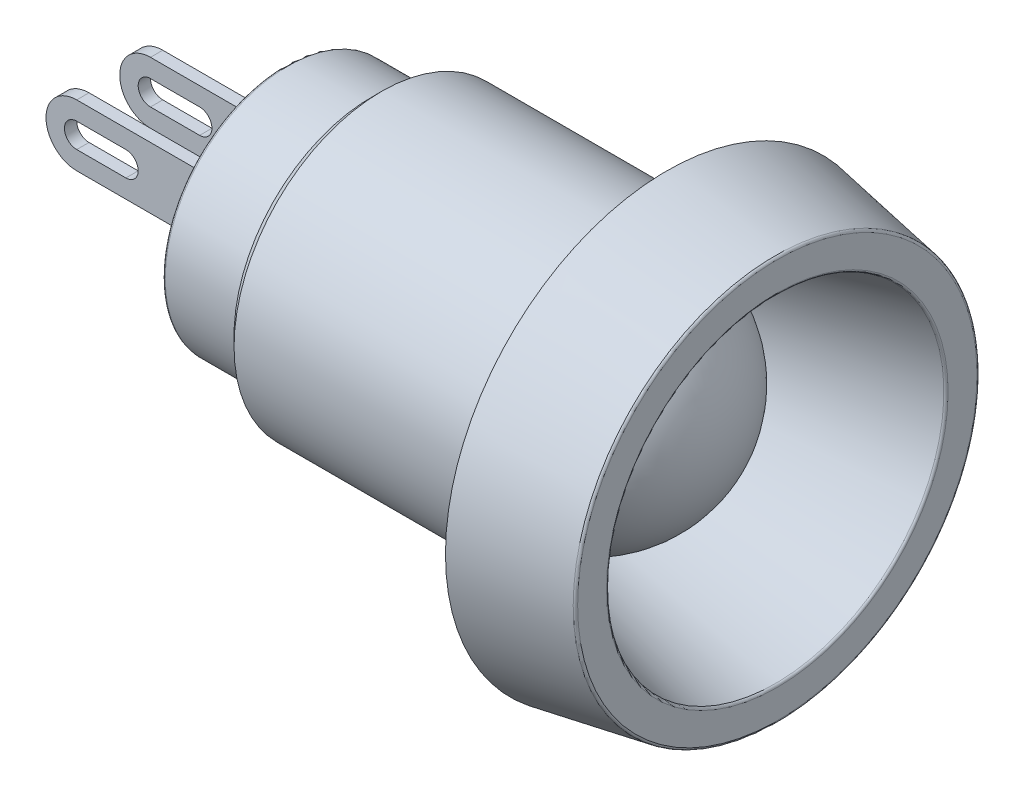
ISO-10303-21;
HEADER;
FILE_DESCRIPTION(('STEP AP214'),'2;1');
FILE_NAME('part.step','',(''),(''),'','','');
FILE_SCHEMA(('AUTOMOTIVE_DESIGN { 1 0 10303 214 1 1 1 1 }'));
ENDSEC;
DATA;
#1=APPLICATION_CONTEXT('core data for automotive mechanical design processes');
#2=APPLICATION_PROTOCOL_DEFINITION('international standard','automotive_design',2000,#1);
#3=PRODUCT_CONTEXT('',#1,'mechanical');
#4=PRODUCT('Part','Part','',(#3));
#5=PRODUCT_RELATED_PRODUCT_CATEGORY('part','',(#4));
#6=PRODUCT_DEFINITION_FORMATION('','',#4);
#7=PRODUCT_DEFINITION_CONTEXT('part definition',#1,'design');
#8=PRODUCT_DEFINITION('design','',#6,#7);
#9=PRODUCT_DEFINITION_SHAPE('','',#8);
#10=(LENGTH_UNIT() NAMED_UNIT(*) SI_UNIT(.MILLI.,.METRE.));
#11=(NAMED_UNIT(*) PLANE_ANGLE_UNIT() SI_UNIT($,.RADIAN.));
#12=(NAMED_UNIT(*) SI_UNIT($,.STERADIAN.) SOLID_ANGLE_UNIT());
#13=UNCERTAINTY_MEASURE_WITH_UNIT(LENGTH_MEASURE(1.E-05),#10,'distance_accuracy_value','');
#14=(GEOMETRIC_REPRESENTATION_CONTEXT(3) GLOBAL_UNCERTAINTY_ASSIGNED_CONTEXT((#13)) GLOBAL_UNIT_ASSIGNED_CONTEXT((#10,
#11,#12)) REPRESENTATION_CONTEXT('',''));
#15=CARTESIAN_POINT('',(0.,0.,0.));
#16=DIRECTION('',(0.,0.,1.));
#17=DIRECTION('',(1.,0.,0.));
#18=AXIS2_PLACEMENT_3D('',#15,#16,#17);
#19=CARTESIAN_POINT('',(9.,0.,0.));
#20=DIRECTION('',(1.,0.,0.));
#21=DIRECTION('',(0.,0.,-1.));
#22=AXIS2_PLACEMENT_3D('',#19,#20,#21);
#23=PLANE('',#22);
#24=DIRECTION('',(0.,1.,0.));
#25=VECTOR('',#24,1.);
#26=CARTESIAN_POINT('',(9.,-1.25,-1.25));
#27=LINE('',#26,#25);
#28=CARTESIAN_POINT('',(9.,-1.25,-1.25));
#29=VERTEX_POINT('',#28);
#30=CARTESIAN_POINT('',(9.,1.25,-1.25));
#31=VERTEX_POINT('',#30);
#32=EDGE_CURVE('E232',#29,#31,#27,.T.);
#33=ORIENTED_EDGE('',*,*,#32,.F.);
#34=DIRECTION('',(0.,0.,-1.));
#35=VECTOR('',#34,1.);
#36=CARTESIAN_POINT('',(9.,-1.25,-1.25));
#37=LINE('',#36,#35);
#38=CARTESIAN_POINT('',(9.,-1.25,-1.75));
#39=VERTEX_POINT('',#38);
#40=EDGE_CURVE('E248',#29,#39,#37,.T.);
#41=ORIENTED_EDGE('',*,*,#40,.T.);
#42=DIRECTION('',(0.,1.,0.));
#43=VECTOR('',#42,1.);
#44=CARTESIAN_POINT('',(9.,-1.25,-1.75));
#45=LINE('',#44,#43);
#46=CARTESIAN_POINT('',(9.,1.25,-1.75));
#47=VERTEX_POINT('',#46);
#48=EDGE_CURVE('E245',#39,#47,#45,.T.);
#49=ORIENTED_EDGE('',*,*,#48,.T.);
#50=DIRECTION('',(0.,0.,-1.));
#51=VECTOR('',#50,1.);
#52=CARTESIAN_POINT('',(9.,1.25,-1.25));
#53=LINE('',#52,#51);
#54=EDGE_CURVE('E242',#31,#47,#53,.T.);
#55=ORIENTED_EDGE('',*,*,#54,.F.);
#56=EDGE_LOOP('',(#33,#41,#49,#55));
#57=FACE_BOUND('',#56,.T.);
#58=DIRECTION('',(0.,0.,1.));
#59=VECTOR('',#58,1.);
#60=CARTESIAN_POINT('',(9.,-1.25,0.));
#61=LINE('',#60,#59);
#62=CARTESIAN_POINT('',(9.,-1.25,1.25));
#63=VERTEX_POINT('',#62);
#64=CARTESIAN_POINT('',(9.,-1.25,1.75));
#65=VERTEX_POINT('',#64);
#66=EDGE_CURVE('E254',#63,#65,#61,.T.);
#67=ORIENTED_EDGE('',*,*,#66,.F.);
#68=DIRECTION('',(0.,1.,0.));
#69=VECTOR('',#68,1.);
#70=CARTESIAN_POINT('',(9.,0.,1.25));
#71=LINE('',#70,#69);
#72=CARTESIAN_POINT('',(9.,1.25,1.25));
#73=VERTEX_POINT('',#72);
#74=EDGE_CURVE('E251',#63,#73,#71,.T.);
#75=ORIENTED_EDGE('',*,*,#74,.T.);
#76=DIRECTION('',(0.,0.,1.));
#77=VECTOR('',#76,1.);
#78=CARTESIAN_POINT('',(9.,1.25,0.));
#79=LINE('',#78,#77);
#80=CARTESIAN_POINT('',(9.,1.25,1.75));
#81=VERTEX_POINT('',#80);
#82=EDGE_CURVE('E260',#73,#81,#79,.T.);
#83=ORIENTED_EDGE('',*,*,#82,.T.);
#84=DIRECTION('',(0.,1.,0.));
#85=VECTOR('',#84,1.);
#86=CARTESIAN_POINT('',(9.,0.,1.75));
#87=LINE('',#86,#85);
#88=EDGE_CURVE('E257',#65,#81,#87,.T.);
#89=ORIENTED_EDGE('',*,*,#88,.F.);
#90=EDGE_LOOP('',(#67,#75,#83,#89));
#91=FACE_BOUND('',#90,.T.);
#92=CARTESIAN_POINT('',(9.,0.,0.));
#93=DIRECTION('',(1.,0.,0.));
#94=DIRECTION('',(0.,0.,-1.));
#95=AXIS2_PLACEMENT_3D('',#92,#93,#94);
#96=CIRCLE('',#95,4.9);
#97=CARTESIAN_POINT('',(9.,0.,-4.9));
#98=VERTEX_POINT('',#97);
#99=EDGE_CURVE('E289',#98,#98,#96,.F.);
#100=ORIENTED_EDGE('',*,*,#99,.T.);
#101=EDGE_LOOP('',(#100));
#102=FACE_BOUND('',#101,.T.);
#103=ADVANCED_FACE('F39',(#57,#91,#102),#23,.F.);
#104=CARTESIAN_POINT('',(9.,0.,0.));
#105=DIRECTION('',(-1.,0.,0.));
#106=DIRECTION('',(0.,0.,1.));
#107=AXIS2_PLACEMENT_3D('',#104,#105,#106);
#108=CYLINDRICAL_SURFACE('',#107,5.);
#109=CARTESIAN_POINT('',(9.1,0.,0.));
#110=DIRECTION('',(1.,0.,0.));
#111=DIRECTION('',(0.,0.,-1.));
#112=AXIS2_PLACEMENT_3D('',#109,#110,#111);
#113=CIRCLE('',#112,5.);
#114=CARTESIAN_POINT('',(9.1,0.,-5.));
#115=VERTEX_POINT('',#114);
#116=EDGE_CURVE('E292',#115,#115,#113,.T.);
#117=ORIENTED_EDGE('',*,*,#116,.T.);
#118=EDGE_LOOP('',(#117));
#119=FACE_BOUND('',#118,.T.);
#120=CARTESIAN_POINT('',(12.5,0.,0.));
#121=DIRECTION('',(-1.,0.,0.));
#122=DIRECTION('',(0.,0.,1.));
#123=AXIS2_PLACEMENT_3D('',#120,#121,#122);
#124=CIRCLE('',#123,5.);
#125=CARTESIAN_POINT('',(12.5,0.,5.));
#126=VERTEX_POINT('',#125);
#127=EDGE_CURVE('E280',#126,#126,#124,.T.);
#128=ORIENTED_EDGE('',*,*,#127,.T.);
#129=EDGE_LOOP('',(#128));
#130=FACE_BOUND('',#129,.T.);
#131=ADVANCED_FACE('F371',(#119,#130),#108,.T.);
#132=CARTESIAN_POINT('',(12.5,5.,0.));
#133=DIRECTION('',(1.,0.,0.));
#134=DIRECTION('',(0.,0.,-1.));
#135=AXIS2_PLACEMENT_3D('',#132,#133,#134);
#136=PLANE('',#135);
#137=CARTESIAN_POINT('',(12.5,0.,0.));
#138=DIRECTION('',(1.,0.,0.));
#139=DIRECTION('',(0.,0.,-1.));
#140=AXIS2_PLACEMENT_3D('',#137,#138,#139);
#141=CIRCLE('',#140,5.60000000000001);
#142=CARTESIAN_POINT('',(12.5,0.,-5.60000000000001));
#143=VERTEX_POINT('',#142);
#144=EDGE_CURVE('E283',#143,#143,#141,.F.);
#145=ORIENTED_EDGE('',*,*,#144,.T.);
#146=EDGE_LOOP('',(#145));
#147=FACE_BOUND('',#146,.T.);
#148=ORIENTED_EDGE('',*,*,#127,.F.);
#149=EDGE_LOOP('',(#148));
#150=FACE_BOUND('',#149,.T.);
#151=ADVANCED_FACE('F376',(#147,#150),#136,.F.);
#152=CARTESIAN_POINT('',(9.,0.,0.));
#153=DIRECTION('',(-1.,0.,0.));
#154=DIRECTION('',(0.,0.,1.));
#155=AXIS2_PLACEMENT_3D('',#152,#153,#154);
#156=CYLINDRICAL_SURFACE('',#155,6.);
#157=CARTESIAN_POINT('',(12.9,0.,0.));
#158=DIRECTION('',(1.,0.,0.));
#159=DIRECTION('',(0.,0.,-1.));
#160=AXIS2_PLACEMENT_3D('',#157,#158,#159);
#161=CIRCLE('',#160,6.);
#162=CARTESIAN_POINT('',(12.9,0.,-6.));
#163=VERTEX_POINT('',#162);
#164=EDGE_CURVE('E286',#163,#163,#161,.T.);
#165=ORIENTED_EDGE('',*,*,#164,.T.);
#166=EDGE_LOOP('',(#165));
#167=FACE_BOUND('',#166,.T.);
#168=CARTESIAN_POINT('',(24.5,0.,0.));
#169=DIRECTION('',(-1.,0.,0.));
#170=DIRECTION('',(0.,0.,1.));
#171=AXIS2_PLACEMENT_3D('',#168,#169,#170);
#172=CIRCLE('',#171,6.);
#173=CARTESIAN_POINT('',(24.5,0.,6.));
#174=VERTEX_POINT('',#173);
#175=EDGE_CURVE('E277',#174,#174,#172,.T.);
#176=ORIENTED_EDGE('',*,*,#175,.T.);
#177=EDGE_LOOP('',(#176));
#178=FACE_BOUND('',#177,.T.);
#179=ADVANCED_FACE('F666',(#167,#178),#156,.T.);
#180=CARTESIAN_POINT('',(24.5,6.,0.));
#181=DIRECTION('',(1.,0.,0.));
#182=DIRECTION('',(0.,0.,-1.));
#183=AXIS2_PLACEMENT_3D('',#180,#181,#182);
#184=PLANE('',#183);
#185=ORIENTED_EDGE('',*,*,#175,.F.);
#186=EDGE_LOOP('',(#185));
#187=FACE_BOUND('',#186,.T.);
#188=CARTESIAN_POINT('',(24.5,0.,0.));
#189=DIRECTION('',(-1.,0.,0.));
#190=DIRECTION('',(0.,0.,1.));
#191=AXIS2_PLACEMENT_3D('',#188,#189,#190);
#192=CIRCLE('',#191,9.);
#193=CARTESIAN_POINT('',(24.5,0.,9.));
#194=VERTEX_POINT('',#193);
#195=EDGE_CURVE('E274',#194,#194,#192,.T.);
#196=ORIENTED_EDGE('',*,*,#195,.T.);
#197=EDGE_LOOP('',(#196));
#198=FACE_BOUND('',#197,.T.);
#199=ADVANCED_FACE('F658',(#187,#198),#184,.F.);
#200=CARTESIAN_POINT('',(29.,0.,0.));
#201=DIRECTION('',(-1.,0.,0.));
#202=DIRECTION('',(0.,0.,1.));
#203=AXIS2_PLACEMENT_3D('',#200,#201,#202);
#204=CONICAL_SURFACE('',#203,8.20652858681191,0.174532925199433);
#205=CARTESIAN_POINT('',(28.9173648177667,0.,0.));
#206=DIRECTION('',(1.,0.,0.));
#207=DIRECTION('',(0.,0.,-1.));
#208=AXIS2_PLACEMENT_3D('',#205,#206,#207);
#209=CIRCLE('',#208,8.2210993989954);
#210=CARTESIAN_POINT('',(28.9173648177667,0.,-8.2210993989954));
#211=VERTEX_POINT('',#210);
#212=EDGE_CURVE('E304',#211,#211,#209,.F.);
#213=ORIENTED_EDGE('',*,*,#212,.T.);
#214=EDGE_LOOP('',(#213));
#215=FACE_BOUND('',#214,.T.);
#216=ORIENTED_EDGE('',*,*,#195,.F.);
#217=EDGE_LOOP('',(#216));
#218=FACE_BOUND('',#217,.T.);
#219=ADVANCED_FACE('F649',(#215,#218),#204,.T.);
#220=CARTESIAN_POINT('',(29.,8.20652858681191,0.));
#221=DIRECTION('',(-1.,0.,0.));
#222=DIRECTION('',(0.,0.,1.));
#223=AXIS2_PLACEMENT_3D('',#220,#221,#222);
#224=PLANE('',#223);
#225=CARTESIAN_POINT('',(29.,0.,0.));
#226=DIRECTION('',(-1.,0.,0.));
#227=DIRECTION('',(0.,0.,1.));
#228=AXIS2_PLACEMENT_3D('',#225,#226,#227);
#229=CIRCLE('',#228,6.94808858397454);
#230=CARTESIAN_POINT('',(29.,0.,6.94808858397454));
#231=VERTEX_POINT('',#230);
#232=EDGE_CURVE('E298',#231,#231,#229,.T.);
#233=ORIENTED_EDGE('',*,*,#232,.T.);
#234=EDGE_LOOP('',(#233));
#235=FACE_BOUND('',#234,.T.);
#236=CARTESIAN_POINT('',(29.,0.,0.));
#237=DIRECTION('',(-1.,0.,0.));
#238=DIRECTION('',(0.,0.,1.));
#239=AXIS2_PLACEMENT_3D('',#236,#237,#238);
#240=CIRCLE('',#239,8.12261862369418);
#241=CARTESIAN_POINT('',(29.,0.,8.12261862369418));
#242=VERTEX_POINT('',#241);
#243=EDGE_CURVE('E295',#242,#242,#240,.F.);
#244=ORIENTED_EDGE('',*,*,#243,.T.);
#245=EDGE_LOOP('',(#244));
#246=FACE_BOUND('',#245,.T.);
#247=ADVANCED_FACE('F640',(#235,#246),#224,.F.);
#248=CARTESIAN_POINT('',(21.5,0.,0.));
#249=DIRECTION('',(1.,0.,0.));
#250=DIRECTION('',(0.,0.,-1.));
#251=AXIS2_PLACEMENT_3D('',#248,#249,#250);
#252=CONICAL_SURFACE('',#251,5.,0.244346095279207);
#253=CARTESIAN_POINT('',(28.92419218956,0.,0.));
#254=DIRECTION('',(-1.,0.,0.));
#255=DIRECTION('',(0.,0.,1.));
#256=AXIS2_PLACEMENT_3D('',#253,#254,#255);
#257=CIRCLE('',#256,6.85105901134694);
#258=CARTESIAN_POINT('',(28.92419218956,0.,6.85105901134694));
#259=VERTEX_POINT('',#258);
#260=EDGE_CURVE('E301',#259,#259,#257,.F.);
#261=ORIENTED_EDGE('',*,*,#260,.T.);
#262=EDGE_LOOP('',(#261));
#263=FACE_BOUND('',#262,.T.);
#264=CARTESIAN_POINT('',(21.5,0.,0.));
#265=DIRECTION('',(-1.,0.,0.));
#266=DIRECTION('',(0.,0.,1.));
#267=AXIS2_PLACEMENT_3D('',#264,#265,#266);
#268=CIRCLE('',#267,5.);
#269=CARTESIAN_POINT('',(21.5,0.,5.));
#270=VERTEX_POINT('',#269);
#271=EDGE_CURVE('E271',#270,#270,#268,.T.);
#272=ORIENTED_EDGE('',*,*,#271,.T.);
#273=EDGE_LOOP('',(#272));
#274=FACE_BOUND('',#273,.T.);
#275=ADVANCED_FACE('F630',(#263,#274),#252,.F.);
#276=CARTESIAN_POINT('',(21.5,0.,0.));
#277=DIRECTION('',(-1.,0.,0.));
#278=DIRECTION('',(0.,1.,0.));
#279=AXIS2_PLACEMENT_3D('',#276,#277,#278);
#280=SPHERICAL_SURFACE('',#279,5.);
#281=ORIENTED_EDGE('',*,*,#271,.F.);
#282=EDGE_LOOP('',(#281));
#283=FACE_BOUND('',#282,.T.);
#284=ADVANCED_FACE('F385',(#283),#280,.T.);
#285=CARTESIAN_POINT('',(12.5,0.,0.));
#286=DIRECTION('',(1.,0.,0.));
#287=DIRECTION('',(0.,0.,-1.));
#288=AXIS2_PLACEMENT_3D('',#285,#286,#287);
#289=CONICAL_SURFACE('',#288,5.60000000000001,0.785398163397446);
#290=ORIENTED_EDGE('',*,*,#164,.F.);
#291=EDGE_LOOP('',(#290));
#292=FACE_BOUND('',#291,.T.);
#293=ORIENTED_EDGE('',*,*,#144,.F.);
#294=EDGE_LOOP('',(#293));
#295=FACE_BOUND('',#294,.T.);
#296=ADVANCED_FACE('F381',(#292,#295),#289,.T.);
#297=CARTESIAN_POINT('',(9.1,0.,0.));
#298=DIRECTION('',(1.,0.,0.));
#299=DIRECTION('',(0.,0.,-1.));
#300=AXIS2_PLACEMENT_3D('',#297,#298,#299);
#301=TOROIDAL_SURFACE('',#300,4.9,0.1);
#302=ORIENTED_EDGE('',*,*,#116,.F.);
#303=EDGE_LOOP('',(#302));
#304=FACE_BOUND('',#303,.T.);
#305=ORIENTED_EDGE('',*,*,#99,.F.);
#306=EDGE_LOOP('',(#305));
#307=FACE_BOUND('',#306,.T.);
#308=ADVANCED_FACE('F384',(#304,#307),#301,.T.);
#309=CARTESIAN_POINT('',(28.9,0.,0.));
#310=DIRECTION('',(-1.,0.,0.));
#311=DIRECTION('',(0.,0.,1.));
#312=AXIS2_PLACEMENT_3D('',#309,#310,#311);
#313=TOROIDAL_SURFACE('',#312,6.94808858397454,0.1);
#314=ORIENTED_EDGE('',*,*,#260,.F.);
#315=EDGE_LOOP('',(#314));
#316=FACE_BOUND('',#315,.T.);
#317=ORIENTED_EDGE('',*,*,#232,.F.);
#318=EDGE_LOOP('',(#317));
#319=FACE_BOUND('',#318,.T.);
#320=ADVANCED_FACE('F389',(#316,#319),#313,.T.);
#321=CARTESIAN_POINT('',(28.9,0.,0.));
#322=DIRECTION('',(-1.,0.,0.));
#323=DIRECTION('',(0.,0.,1.));
#324=AXIS2_PLACEMENT_3D('',#321,#322,#323);
#325=TOROIDAL_SURFACE('',#324,8.12261862369418,0.1);
#326=ORIENTED_EDGE('',*,*,#243,.F.);
#327=EDGE_LOOP('',(#326));
#328=FACE_BOUND('',#327,.T.);
#329=ORIENTED_EDGE('',*,*,#212,.F.);
#330=EDGE_LOOP('',(#329));
#331=FACE_BOUND('',#330,.T.);
#332=ADVANCED_FACE('F393',(#328,#331),#325,.T.);
#333=CARTESIAN_POINT('',(1.,0.,1.25));
#334=DIRECTION('',(0.,0.,-1.));
#335=DIRECTION('',(-1.,0.,0.));
#336=AXIS2_PLACEMENT_3D('',#333,#334,#335);
#337=PLANE('',#336);
#338=CARTESIAN_POINT('',(4.25,0.,1.25));
#339=DIRECTION('',(0.,0.,-1.));
#340=DIRECTION('',(-1.,0.,0.));
#341=AXIS2_PLACEMENT_3D('',#338,#339,#340);
#342=CIRCLE('',#341,0.5);
#343=CARTESIAN_POINT('',(4.25,0.5,1.25));
#344=VERTEX_POINT('',#343);
#345=CARTESIAN_POINT('',(4.25,-0.5,1.25));
#346=VERTEX_POINT('',#345);
#347=EDGE_CURVE('E228',#344,#346,#342,.T.);
#348=ORIENTED_EDGE('',*,*,#347,.F.);
#349=DIRECTION('',(1.,0.,0.));
#350=VECTOR('',#349,1.);
#351=CARTESIAN_POINT('',(1.,0.5,1.25));
#352=LINE('',#351,#350);
#353=CARTESIAN_POINT('',(2.25,0.5,1.25));
#354=VERTEX_POINT('',#353);
#355=EDGE_CURVE('E220',#354,#344,#352,.T.);
#356=ORIENTED_EDGE('',*,*,#355,.F.);
#357=CARTESIAN_POINT('',(2.25,0.,1.25));
#358=DIRECTION('',(0.,0.,-1.));
#359=DIRECTION('',(-1.,0.,0.));
#360=AXIS2_PLACEMENT_3D('',#357,#358,#359);
#361=CIRCLE('',#360,0.5);
#362=CARTESIAN_POINT('',(2.25,-0.499999999999999,1.25));
#363=VERTEX_POINT('',#362);
#364=EDGE_CURVE('E212',#363,#354,#361,.T.);
#365=ORIENTED_EDGE('',*,*,#364,.F.);
#366=DIRECTION('',(-1.,0.,0.));
#367=VECTOR('',#366,1.);
#368=CARTESIAN_POINT('',(1.,-0.5,1.25));
#369=LINE('',#368,#367);
#370=EDGE_CURVE('E206',#346,#363,#369,.T.);
#371=ORIENTED_EDGE('',*,*,#370,.F.);
#372=EDGE_LOOP('',(#348,#356,#365,#371));
#373=FACE_BOUND('',#372,.T.);
#374=DIRECTION('',(1.,0.,0.));
#375=VECTOR('',#374,1.);
#376=CARTESIAN_POINT('',(1.,-1.25,1.25));
#377=LINE('',#376,#375);
#378=CARTESIAN_POINT('',(2.25,-1.25,1.25));
#379=VERTEX_POINT('',#378);
#380=EDGE_CURVE('E269',#379,#63,#377,.T.);
#381=ORIENTED_EDGE('',*,*,#380,.F.);
#382=CARTESIAN_POINT('',(2.25,0.,1.25));
#383=DIRECTION('',(0.,0.,-1.));
#384=DIRECTION('',(-1.,0.,0.));
#385=AXIS2_PLACEMENT_3D('',#382,#383,#384);
#386=CIRCLE('',#385,1.25);
#387=CARTESIAN_POINT('',(1.,0.,1.25));
#388=VERTEX_POINT('',#387);
#389=EDGE_CURVE('E316',#379,#388,#386,.T.);
#390=ORIENTED_EDGE('',*,*,#389,.T.);
#391=CARTESIAN_POINT('',(2.25,0.,1.25));
#392=DIRECTION('',(0.,0.,-1.));
#393=DIRECTION('',(-1.,0.,0.));
#394=AXIS2_PLACEMENT_3D('',#391,#392,#393);
#395=CIRCLE('',#394,1.25);
#396=CARTESIAN_POINT('',(2.25,1.25,1.25));
#397=VERTEX_POINT('',#396);
#398=EDGE_CURVE('E314',#388,#397,#395,.T.);
#399=ORIENTED_EDGE('',*,*,#398,.T.);
#400=DIRECTION('',(1.,0.,0.));
#401=VECTOR('',#400,1.);
#402=CARTESIAN_POINT('',(1.,1.25,1.25));
#403=LINE('',#402,#401);
#404=EDGE_CURVE('E263',#397,#73,#403,.T.);
#405=ORIENTED_EDGE('',*,*,#404,.T.);
#406=ORIENTED_EDGE('',*,*,#74,.F.);
#407=EDGE_LOOP('',(#381,#390,#399,#405,#406));
#408=FACE_BOUND('',#407,.T.);
#409=ADVANCED_FACE('F397',(#373,#408),#337,.T.);
#410=CARTESIAN_POINT('',(1.,-1.25,0.));
#411=DIRECTION('',(0.,1.,0.));
#412=DIRECTION('',(0.,0.,1.));
#413=AXIS2_PLACEMENT_3D('',#410,#411,#412);
#414=PLANE('',#413);
#415=DIRECTION('',(1.,0.,0.));
#416=VECTOR('',#415,1.);
#417=CARTESIAN_POINT('',(1.,-1.25,1.75));
#418=LINE('',#417,#416);
#419=CARTESIAN_POINT('',(2.25,-1.25,1.75));
#420=VERTEX_POINT('',#419);
#421=EDGE_CURVE('E267',#420,#65,#418,.T.);
#422=ORIENTED_EDGE('',*,*,#421,.F.);
#423=DIRECTION('',(0.,0.,1.));
#424=VECTOR('',#423,1.);
#425=CARTESIAN_POINT('',(2.25,-1.25,1.25));
#426=LINE('',#425,#424);
#427=EDGE_CURVE('E311',#420,#379,#426,.F.);
#428=ORIENTED_EDGE('',*,*,#427,.T.);
#429=ORIENTED_EDGE('',*,*,#380,.T.);
#430=ORIENTED_EDGE('',*,*,#66,.T.);
#431=EDGE_LOOP('',(#422,#428,#429,#430));
#432=FACE_BOUND('',#431,.T.);
#433=ADVANCED_FACE('F441',(#432),#414,.F.);
#434=CARTESIAN_POINT('',(1.,0.,1.75));
#435=DIRECTION('',(0.,0.,-1.));
#436=DIRECTION('',(-1.,0.,0.));
#437=AXIS2_PLACEMENT_3D('',#434,#435,#436);
#438=PLANE('',#437);
#439=DIRECTION('',(1.,0.,0.));
#440=VECTOR('',#439,1.);
#441=CARTESIAN_POINT('',(1.,0.500000000000001,1.75));
#442=LINE('',#441,#440);
#443=CARTESIAN_POINT('',(2.25,0.500000000000001,1.75));
#444=VERTEX_POINT('',#443);
#445=CARTESIAN_POINT('',(4.25,0.500000000000001,1.75));
#446=VERTEX_POINT('',#445);
#447=EDGE_CURVE('E217',#444,#446,#442,.T.);
#448=ORIENTED_EDGE('',*,*,#447,.T.);
#449=CARTESIAN_POINT('',(4.25,0.,1.75));
#450=DIRECTION('',(0.,0.,-1.));
#451=DIRECTION('',(-1.,0.,0.));
#452=AXIS2_PLACEMENT_3D('',#449,#450,#451);
#453=CIRCLE('',#452,0.5);
#454=CARTESIAN_POINT('',(4.25,-0.499999999999999,1.75));
#455=VERTEX_POINT('',#454);
#456=EDGE_CURVE('E225',#446,#455,#453,.T.);
#457=ORIENTED_EDGE('',*,*,#456,.T.);
#458=DIRECTION('',(-1.,0.,0.));
#459=VECTOR('',#458,1.);
#460=CARTESIAN_POINT('',(1.,-0.499999999999999,1.75));
#461=LINE('',#460,#459);
#462=CARTESIAN_POINT('',(2.25,-0.499999999999999,1.75));
#463=VERTEX_POINT('',#462);
#464=EDGE_CURVE('E203',#455,#463,#461,.T.);
#465=ORIENTED_EDGE('',*,*,#464,.T.);
#466=CARTESIAN_POINT('',(2.25,0.,1.75));
#467=DIRECTION('',(0.,0.,-1.));
#468=DIRECTION('',(-1.,0.,0.));
#469=AXIS2_PLACEMENT_3D('',#466,#467,#468);
#470=CIRCLE('',#469,0.5);
#471=EDGE_CURVE('E209',#463,#444,#470,.T.);
#472=ORIENTED_EDGE('',*,*,#471,.T.);
#473=EDGE_LOOP('',(#448,#457,#465,#472));
#474=FACE_BOUND('',#473,.T.);
#475=CARTESIAN_POINT('',(2.25,0.,1.75));
#476=DIRECTION('',(0.,0.,-1.));
#477=DIRECTION('',(-1.,0.,0.));
#478=AXIS2_PLACEMENT_3D('',#475,#476,#477);
#479=CIRCLE('',#478,1.25);
#480=CARTESIAN_POINT('',(2.25,1.25,1.75));
#481=VERTEX_POINT('',#480);
#482=CARTESIAN_POINT('',(1.,0.,1.75));
#483=VERTEX_POINT('',#482);
#484=EDGE_CURVE('E307',#481,#483,#479,.F.);
#485=ORIENTED_EDGE('',*,*,#484,.T.);
#486=CARTESIAN_POINT('',(2.25,0.,1.75));
#487=DIRECTION('',(0.,0.,-1.));
#488=DIRECTION('',(-1.,0.,0.));
#489=AXIS2_PLACEMENT_3D('',#486,#487,#488);
#490=CIRCLE('',#489,1.25);
#491=EDGE_CURVE('E309',#483,#420,#490,.F.);
#492=ORIENTED_EDGE('',*,*,#491,.T.);
#493=ORIENTED_EDGE('',*,*,#421,.T.);
#494=ORIENTED_EDGE('',*,*,#88,.T.);
#495=DIRECTION('',(1.,0.,0.));
#496=VECTOR('',#495,1.);
#497=CARTESIAN_POINT('',(1.,1.25,1.75));
#498=LINE('',#497,#496);
#499=EDGE_CURVE('E265',#481,#81,#498,.T.);
#500=ORIENTED_EDGE('',*,*,#499,.F.);
#501=EDGE_LOOP('',(#485,#492,#493,#494,#500));
#502=FACE_BOUND('',#501,.T.);
#503=ADVANCED_FACE('F520',(#474,#502),#438,.F.);
#504=CARTESIAN_POINT('',(1.,1.25,0.));
#505=DIRECTION('',(0.,1.,0.));
#506=DIRECTION('',(0.,0.,1.));
#507=AXIS2_PLACEMENT_3D('',#504,#505,#506);
#508=PLANE('',#507);
#509=ORIENTED_EDGE('',*,*,#404,.F.);
#510=DIRECTION('',(0.,0.,1.));
#511=VECTOR('',#510,1.);
#512=CARTESIAN_POINT('',(2.25,1.25,0.));
#513=LINE('',#512,#511);
#514=EDGE_CURVE('E48',#397,#481,#513,.T.);
#515=ORIENTED_EDGE('',*,*,#514,.T.);
#516=ORIENTED_EDGE('',*,*,#499,.T.);
#517=ORIENTED_EDGE('',*,*,#82,.F.);
#518=EDGE_LOOP('',(#509,#515,#516,#517));
#519=FACE_BOUND('',#518,.T.);
#520=ADVANCED_FACE('F367',(#519),#508,.T.);
#521=CARTESIAN_POINT('',(1.,-1.25,-1.25));
#522=DIRECTION('',(0.,-1.,0.));
#523=DIRECTION('',(0.,0.,-1.));
#524=AXIS2_PLACEMENT_3D('',#521,#522,#523);
#525=PLANE('',#524);
#526=DIRECTION('',(1.,0.,0.));
#527=VECTOR('',#526,1.);
#528=CARTESIAN_POINT('',(1.,-1.25,-1.25));
#529=LINE('',#528,#527);
#530=CARTESIAN_POINT('',(2.25,-1.25,-1.25));
#531=VERTEX_POINT('',#530);
#532=EDGE_CURVE('E237',#531,#29,#529,.T.);
#533=ORIENTED_EDGE('',*,*,#532,.F.);
#534=DIRECTION('',(0.,0.,-1.));
#535=VECTOR('',#534,1.);
#536=CARTESIAN_POINT('',(2.25,-1.25,-1.75));
#537=LINE('',#536,#535);
#538=CARTESIAN_POINT('',(2.25,-1.25,-1.75));
#539=VERTEX_POINT('',#538);
#540=EDGE_CURVE('E318',#531,#539,#537,.T.);
#541=ORIENTED_EDGE('',*,*,#540,.T.);
#542=DIRECTION('',(1.,0.,0.));
#543=VECTOR('',#542,1.);
#544=CARTESIAN_POINT('',(1.,-1.25,-1.75));
#545=LINE('',#544,#543);
#546=EDGE_CURVE('E230',#539,#39,#545,.T.);
#547=ORIENTED_EDGE('',*,*,#546,.T.);
#548=ORIENTED_EDGE('',*,*,#40,.F.);
#549=EDGE_LOOP('',(#533,#541,#547,#548));
#550=FACE_BOUND('',#549,.T.);
#551=ADVANCED_FACE('F356',(#550),#525,.T.);
#552=CARTESIAN_POINT('',(1.,-1.25,-1.25));
#553=DIRECTION('',(0.,0.,-1.));
#554=DIRECTION('',(0.,1.,0.));
#555=AXIS2_PLACEMENT_3D('',#552,#553,#554);
#556=PLANE('',#555);
#557=DIRECTION('',(1.,0.,0.));
#558=VECTOR('',#557,1.);
#559=CARTESIAN_POINT('',(1.,0.5,-1.25));
#560=LINE('',#559,#558);
#561=CARTESIAN_POINT('',(2.25,0.499999999999999,-1.25));
#562=VERTEX_POINT('',#561);
#563=CARTESIAN_POINT('',(4.25,0.499999999999999,-1.25));
#564=VERTEX_POINT('',#563);
#565=EDGE_CURVE('E214',#562,#564,#560,.T.);
#566=ORIENTED_EDGE('',*,*,#565,.T.);
#567=CARTESIAN_POINT('',(4.25,0.,-1.25));
#568=DIRECTION('',(0.,0.,-1.));
#569=DIRECTION('',(0.,1.,0.));
#570=AXIS2_PLACEMENT_3D('',#567,#568,#569);
#571=CIRCLE('',#570,0.5);
#572=CARTESIAN_POINT('',(4.25,-0.500000000000001,-1.25));
#573=VERTEX_POINT('',#572);
#574=EDGE_CURVE('E222',#564,#573,#571,.T.);
#575=ORIENTED_EDGE('',*,*,#574,.T.);
#576=DIRECTION('',(-1.,0.,0.));
#577=VECTOR('',#576,1.);
#578=CARTESIAN_POINT('',(1.,-0.500000000000001,-1.25));
#579=LINE('',#578,#577);
#580=CARTESIAN_POINT('',(2.25,-0.500000000000001,-1.25));
#581=VERTEX_POINT('',#580);
#582=EDGE_CURVE('E201',#573,#581,#579,.T.);
#583=ORIENTED_EDGE('',*,*,#582,.T.);
#584=CARTESIAN_POINT('',(2.25,0.,-1.25));
#585=DIRECTION('',(0.,0.,-1.));
#586=DIRECTION('',(0.,1.,0.));
#587=AXIS2_PLACEMENT_3D('',#584,#585,#586);
#588=CIRCLE('',#587,0.5);
#589=EDGE_CURVE('E172',#581,#562,#588,.T.);
#590=ORIENTED_EDGE('',*,*,#589,.T.);
#591=EDGE_LOOP('',(#566,#575,#583,#590));
#592=FACE_BOUND('',#591,.T.);
#593=CARTESIAN_POINT('',(2.25,0.,-1.25));
#594=DIRECTION('',(0.,0.,-1.));
#595=DIRECTION('',(0.,1.,0.));
#596=AXIS2_PLACEMENT_3D('',#593,#594,#595);
#597=CIRCLE('',#596,1.25);
#598=CARTESIAN_POINT('',(2.25,1.25,-1.25));
#599=VERTEX_POINT('',#598);
#600=CARTESIAN_POINT('',(1.,0.,-1.25));
#601=VERTEX_POINT('',#600);
#602=EDGE_CURVE('E325',#599,#601,#597,.F.);
#603=ORIENTED_EDGE('',*,*,#602,.T.);
#604=CARTESIAN_POINT('',(2.25,0.,-1.25));
#605=DIRECTION('',(0.,0.,-1.));
#606=DIRECTION('',(0.,1.,0.));
#607=AXIS2_PLACEMENT_3D('',#604,#605,#606);
#608=CIRCLE('',#607,1.25);
#609=EDGE_CURVE('E327',#601,#531,#608,.F.);
#610=ORIENTED_EDGE('',*,*,#609,.T.);
#611=ORIENTED_EDGE('',*,*,#532,.T.);
#612=ORIENTED_EDGE('',*,*,#32,.T.);
#613=DIRECTION('',(1.,0.,0.));
#614=VECTOR('',#613,1.);
#615=CARTESIAN_POINT('',(1.,1.25,-1.25));
#616=LINE('',#615,#614);
#617=EDGE_CURVE('E235',#599,#31,#616,.T.);
#618=ORIENTED_EDGE('',*,*,#617,.F.);
#619=EDGE_LOOP('',(#603,#610,#611,#612,#618));
#620=FACE_BOUND('',#619,.T.);
#621=ADVANCED_FACE('F358',(#592,#620),#556,.F.);
#622=CARTESIAN_POINT('',(1.,1.25,-1.25));
#623=DIRECTION('',(0.,-1.,0.));
#624=DIRECTION('',(0.,0.,-1.));
#625=AXIS2_PLACEMENT_3D('',#622,#623,#624);
#626=PLANE('',#625);
#627=DIRECTION('',(1.,0.,0.));
#628=VECTOR('',#627,1.);
#629=CARTESIAN_POINT('',(1.,1.25,-1.75));
#630=LINE('',#629,#628);
#631=CARTESIAN_POINT('',(2.25,1.25,-1.75));
#632=VERTEX_POINT('',#631);
#633=EDGE_CURVE('E233',#632,#47,#630,.T.);
#634=ORIENTED_EDGE('',*,*,#633,.F.);
#635=DIRECTION('',(0.,0.,-1.));
#636=VECTOR('',#635,1.);
#637=CARTESIAN_POINT('',(2.25,1.25,-1.25));
#638=LINE('',#637,#636);
#639=EDGE_CURVE('E11',#632,#599,#638,.F.);
#640=ORIENTED_EDGE('',*,*,#639,.T.);
#641=ORIENTED_EDGE('',*,*,#617,.T.);
#642=ORIENTED_EDGE('',*,*,#54,.T.);
#643=EDGE_LOOP('',(#634,#640,#641,#642));
#644=FACE_BOUND('',#643,.T.);
#645=ADVANCED_FACE('F347',(#644),#626,.F.);
#646=CARTESIAN_POINT('',(1.,-1.25,-1.75));
#647=DIRECTION('',(0.,0.,-1.));
#648=DIRECTION('',(0.,1.,0.));
#649=AXIS2_PLACEMENT_3D('',#646,#647,#648);
#650=PLANE('',#649);
#651=CARTESIAN_POINT('',(4.25,0.,-1.75));
#652=DIRECTION('',(0.,0.,-1.));
#653=DIRECTION('',(0.,1.,0.));
#654=AXIS2_PLACEMENT_3D('',#651,#652,#653);
#655=CIRCLE('',#654,0.5);
#656=CARTESIAN_POINT('',(4.25,0.499999999999999,-1.75));
#657=VERTEX_POINT('',#656);
#658=CARTESIAN_POINT('',(4.25,-0.500000000000001,-1.75));
#659=VERTEX_POINT('',#658);
#660=EDGE_CURVE('E184',#657,#659,#655,.T.);
#661=ORIENTED_EDGE('',*,*,#660,.F.);
#662=DIRECTION('',(1.,0.,0.));
#663=VECTOR('',#662,1.);
#664=CARTESIAN_POINT('',(4.25,0.499999999999999,-1.75));
#665=LINE('',#664,#663);
#666=CARTESIAN_POINT('',(2.25,0.499999999999999,-1.75));
#667=VERTEX_POINT('',#666);
#668=EDGE_CURVE('E189',#667,#657,#665,.T.);
#669=ORIENTED_EDGE('',*,*,#668,.F.);
#670=CARTESIAN_POINT('',(2.25,0.,-1.75));
#671=DIRECTION('',(0.,0.,-1.));
#672=DIRECTION('',(0.,1.,0.));
#673=AXIS2_PLACEMENT_3D('',#670,#671,#672);
#674=CIRCLE('',#673,0.5);
#675=CARTESIAN_POINT('',(2.25,-0.5,-1.75));
#676=VERTEX_POINT('',#675);
#677=EDGE_CURVE('E169',#676,#667,#674,.T.);
#678=ORIENTED_EDGE('',*,*,#677,.F.);
#679=DIRECTION('',(-1.,0.,0.));
#680=VECTOR('',#679,1.);
#681=CARTESIAN_POINT('',(4.25,-0.500000000000001,-1.75));
#682=LINE('',#681,#680);
#683=EDGE_CURVE('E178',#659,#676,#682,.T.);
#684=ORIENTED_EDGE('',*,*,#683,.F.);
#685=EDGE_LOOP('',(#661,#669,#678,#684));
#686=FACE_BOUND('',#685,.T.);
#687=ORIENTED_EDGE('',*,*,#546,.F.);
#688=CARTESIAN_POINT('',(2.25,0.,-1.75));
#689=DIRECTION('',(0.,0.,-1.));
#690=DIRECTION('',(0.,1.,0.));
#691=AXIS2_PLACEMENT_3D('',#688,#689,#690);
#692=CIRCLE('',#691,1.25);
#693=CARTESIAN_POINT('',(1.,0.,-1.75));
#694=VERTEX_POINT('',#693);
#695=EDGE_CURVE('E323',#539,#694,#692,.T.);
#696=ORIENTED_EDGE('',*,*,#695,.T.);
#697=CARTESIAN_POINT('',(2.25,0.,-1.75));
#698=DIRECTION('',(0.,0.,-1.));
#699=DIRECTION('',(0.,1.,0.));
#700=AXIS2_PLACEMENT_3D('',#697,#698,#699);
#701=CIRCLE('',#700,1.25);
#702=EDGE_CURVE('E321',#694,#632,#701,.T.);
#703=ORIENTED_EDGE('',*,*,#702,.T.);
#704=ORIENTED_EDGE('',*,*,#633,.T.);
#705=ORIENTED_EDGE('',*,*,#48,.F.);
#706=EDGE_LOOP('',(#687,#696,#703,#704,#705));
#707=FACE_BOUND('',#706,.T.);
#708=ADVANCED_FACE('F186',(#686,#707),#650,.T.);
#709=CARTESIAN_POINT('',(2.25,0.,0.));
#710=DIRECTION('',(0.,0.,1.));
#711=DIRECTION('',(1.,0.,0.));
#712=AXIS2_PLACEMENT_3D('',#709,#710,#711);
#713=CYLINDRICAL_SURFACE('',#712,1.25);
#714=ORIENTED_EDGE('',*,*,#514,.F.);
#715=ORIENTED_EDGE('',*,*,#398,.F.);
#716=DIRECTION('',(0.,0.,1.));
#717=VECTOR('',#716,1.);
#718=CARTESIAN_POINT('',(1.,0.,0.));
#719=LINE('',#718,#717);
#720=EDGE_CURVE('E239',#483,#388,#719,.F.);
#721=ORIENTED_EDGE('',*,*,#720,.F.);
#722=ORIENTED_EDGE('',*,*,#484,.F.);
#723=EDGE_LOOP('',(#714,#715,#721,#722));
#724=FACE_BOUND('',#723,.T.);
#725=ADVANCED_FACE('F402',(#724),#713,.T.);
#726=CARTESIAN_POINT('',(2.25,0.,0.));
#727=DIRECTION('',(0.,0.,-1.));
#728=DIRECTION('',(-1.,0.,0.));
#729=AXIS2_PLACEMENT_3D('',#726,#727,#728);
#730=CYLINDRICAL_SURFACE('',#729,1.25);
#731=ORIENTED_EDGE('',*,*,#389,.F.);
#732=ORIENTED_EDGE('',*,*,#427,.F.);
#733=ORIENTED_EDGE('',*,*,#491,.F.);
#734=ORIENTED_EDGE('',*,*,#720,.T.);
#735=EDGE_LOOP('',(#731,#732,#733,#734));
#736=FACE_BOUND('',#735,.T.);
#737=ADVANCED_FACE('F399',(#736),#730,.T.);
#738=CARTESIAN_POINT('',(2.25,0.,0.));
#739=DIRECTION('',(0.,0.,-1.));
#740=DIRECTION('',(0.,1.,0.));
#741=AXIS2_PLACEMENT_3D('',#738,#739,#740);
#742=CYLINDRICAL_SURFACE('',#741,1.25);
#743=DIRECTION('',(0.,0.,-1.));
#744=VECTOR('',#743,1.);
#745=CARTESIAN_POINT('',(1.,0.,0.));
#746=LINE('',#745,#744);
#747=EDGE_CURVE('E43',#601,#694,#746,.T.);
#748=ORIENTED_EDGE('',*,*,#747,.F.);
#749=ORIENTED_EDGE('',*,*,#602,.F.);
#750=ORIENTED_EDGE('',*,*,#639,.F.);
#751=ORIENTED_EDGE('',*,*,#702,.F.);
#752=EDGE_LOOP('',(#748,#749,#750,#751));
#753=FACE_BOUND('',#752,.T.);
#754=ADVANCED_FACE('F41',(#753),#742,.T.);
#755=CARTESIAN_POINT('',(2.25,0.,-1.25));
#756=DIRECTION('',(0.,0.,1.));
#757=DIRECTION('',(0.,-1.,0.));
#758=AXIS2_PLACEMENT_3D('',#755,#756,#757);
#759=CYLINDRICAL_SURFACE('',#758,1.25);
#760=ORIENTED_EDGE('',*,*,#609,.F.);
#761=ORIENTED_EDGE('',*,*,#747,.T.);
#762=ORIENTED_EDGE('',*,*,#695,.F.);
#763=ORIENTED_EDGE('',*,*,#540,.F.);
#764=EDGE_LOOP('',(#760,#761,#762,#763));
#765=FACE_BOUND('',#764,.T.);
#766=ADVANCED_FACE('F337',(#765),#759,.T.);
#767=CARTESIAN_POINT('',(4.25,-0.499999999999997,9.));
#768=DIRECTION('',(0.,-1.,0.));
#769=DIRECTION('',(0.,0.,-1.));
#770=AXIS2_PLACEMENT_3D('',#767,#768,#769);
#771=PLANE('',#770);
#772=DIRECTION('',(0.,0.,-1.));
#773=VECTOR('',#772,1.);
#774=CARTESIAN_POINT('',(4.25,-0.499999999999997,9.));
#775=LINE('',#774,#773);
#776=EDGE_CURVE('E181',#573,#659,#775,.T.);
#777=ORIENTED_EDGE('',*,*,#776,.T.);
#778=ORIENTED_EDGE('',*,*,#683,.T.);
#779=DIRECTION('',(0.,0.,-1.));
#780=VECTOR('',#779,1.);
#781=CARTESIAN_POINT('',(2.25,-0.499999999999996,9.));
#782=LINE('',#781,#780);
#783=EDGE_CURVE('E164',#581,#676,#782,.T.);
#784=ORIENTED_EDGE('',*,*,#783,.F.);
#785=ORIENTED_EDGE('',*,*,#582,.F.);
#786=EDGE_LOOP('',(#777,#778,#784,#785));
#787=FACE_BOUND('',#786,.T.);
#788=ADVANCED_FACE('F179',(#787),#771,.F.);
#789=CARTESIAN_POINT('',(2.25,0.,9.));
#790=DIRECTION('',(0.,0.,-1.));
#791=DIRECTION('',(0.,1.,0.));
#792=AXIS2_PLACEMENT_3D('',#789,#790,#791);
#793=CYLINDRICAL_SURFACE('',#792,0.5);
#794=ORIENTED_EDGE('',*,*,#783,.T.);
#795=ORIENTED_EDGE('',*,*,#677,.T.);
#796=DIRECTION('',(0.,0.,-1.));
#797=VECTOR('',#796,1.);
#798=CARTESIAN_POINT('',(2.25,0.500000000000003,9.));
#799=LINE('',#798,#797);
#800=EDGE_CURVE('E198',#562,#667,#799,.T.);
#801=ORIENTED_EDGE('',*,*,#800,.F.);
#802=ORIENTED_EDGE('',*,*,#589,.F.);
#803=EDGE_LOOP('',(#794,#795,#801,#802));
#804=FACE_BOUND('',#803,.T.);
#805=ADVANCED_FACE('F166',(#804),#793,.F.);
#806=CARTESIAN_POINT('',(4.25,0.500000000000003,9.));
#807=DIRECTION('',(0.,1.,0.));
#808=DIRECTION('',(0.,0.,1.));
#809=AXIS2_PLACEMENT_3D('',#806,#807,#808);
#810=PLANE('',#809);
#811=ORIENTED_EDGE('',*,*,#800,.T.);
#812=ORIENTED_EDGE('',*,*,#668,.T.);
#813=DIRECTION('',(0.,0.,-1.));
#814=VECTOR('',#813,1.);
#815=CARTESIAN_POINT('',(4.25,0.500000000000003,9.));
#816=LINE('',#815,#814);
#817=EDGE_CURVE('E194',#564,#657,#816,.T.);
#818=ORIENTED_EDGE('',*,*,#817,.F.);
#819=ORIENTED_EDGE('',*,*,#565,.F.);
#820=EDGE_LOOP('',(#811,#812,#818,#819));
#821=FACE_BOUND('',#820,.T.);
#822=ADVANCED_FACE('F461',(#821),#810,.F.);
#823=CARTESIAN_POINT('',(4.25,0.,9.));
#824=DIRECTION('',(0.,0.,-1.));
#825=DIRECTION('',(0.,1.,0.));
#826=AXIS2_PLACEMENT_3D('',#823,#824,#825);
#827=CYLINDRICAL_SURFACE('',#826,0.5);
#828=ORIENTED_EDGE('',*,*,#817,.T.);
#829=ORIENTED_EDGE('',*,*,#660,.T.);
#830=ORIENTED_EDGE('',*,*,#776,.F.);
#831=ORIENTED_EDGE('',*,*,#574,.F.);
#832=EDGE_LOOP('',(#828,#829,#830,#831));
#833=FACE_BOUND('',#832,.T.);
#834=ADVANCED_FACE('F473',(#833),#827,.F.);
#835=ORIENTED_EDGE('',*,*,#347,.T.);
#836=EDGE_CURVE('E56',#455,#346,#775,.T.);
#837=ORIENTED_EDGE('',*,*,#836,.F.);
#838=ORIENTED_EDGE('',*,*,#456,.F.);
#839=EDGE_CURVE('E196',#446,#344,#816,.T.);
#840=ORIENTED_EDGE('',*,*,#839,.T.);
#841=EDGE_LOOP('',(#835,#837,#838,#840));
#842=FACE_BOUND('',#841,.T.);
#843=ADVANCED_FACE('F458',(#842),#827,.F.);
#844=ORIENTED_EDGE('',*,*,#355,.T.);
#845=ORIENTED_EDGE('',*,*,#839,.F.);
#846=ORIENTED_EDGE('',*,*,#447,.F.);
#847=EDGE_CURVE('E197',#444,#354,#799,.T.);
#848=ORIENTED_EDGE('',*,*,#847,.T.);
#849=EDGE_LOOP('',(#844,#845,#846,#848));
#850=FACE_BOUND('',#849,.T.);
#851=ADVANCED_FACE('F452',(#850),#810,.F.);
#852=ORIENTED_EDGE('',*,*,#364,.T.);
#853=ORIENTED_EDGE('',*,*,#847,.F.);
#854=ORIENTED_EDGE('',*,*,#471,.F.);
#855=EDGE_CURVE('E61',#463,#363,#782,.T.);
#856=ORIENTED_EDGE('',*,*,#855,.T.);
#857=EDGE_LOOP('',(#852,#853,#854,#856));
#858=FACE_BOUND('',#857,.T.);
#859=ADVANCED_FACE('F457',(#858),#793,.F.);
#860=ORIENTED_EDGE('',*,*,#370,.T.);
#861=ORIENTED_EDGE('',*,*,#855,.F.);
#862=ORIENTED_EDGE('',*,*,#464,.F.);
#863=ORIENTED_EDGE('',*,*,#836,.T.);
#864=EDGE_LOOP('',(#860,#861,#862,#863));
#865=FACE_BOUND('',#864,.T.);
#866=ADVANCED_FACE('F411',(#865),#771,.F.);
#867=CLOSED_SHELL('',(#103,#131,#151,#179,#199,#219,#247,#275,#284,#296,#308,#320,#332,#409,
#433,#503,#520,#551,#621,#645,#708,#725,#737,#754,#766,#788,#805,#822,#834,#843,#851,#859,#866));
#868=MANIFOLD_SOLID_BREP('B2',#867);
#869=ADVANCED_BREP_SHAPE_REPRESENTATION('',(#18,#868),#14);
#870=SHAPE_DEFINITION_REPRESENTATION(#9,#869);
ENDSEC;
END-ISO-10303-21;
